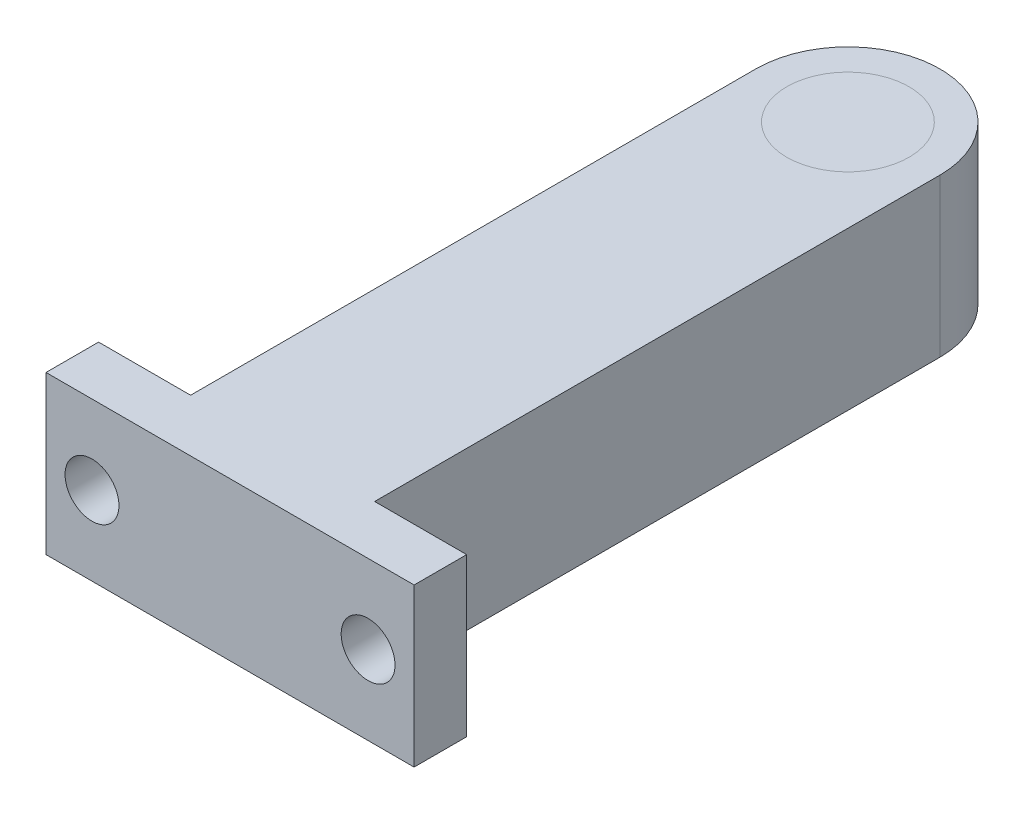
ISO-10303-21;
HEADER;
FILE_DESCRIPTION(('STEP AP214'),'2;1');
FILE_NAME('part.step','',(''),(''),'','','');
FILE_SCHEMA(('AUTOMOTIVE_DESIGN { 1 0 10303 214 1 1 1 1 }'));
ENDSEC;
DATA;
#1=APPLICATION_CONTEXT('core data for automotive mechanical design processes');
#2=APPLICATION_PROTOCOL_DEFINITION('international standard','automotive_design',2000,#1);
#3=PRODUCT_CONTEXT('',#1,'mechanical');
#4=PRODUCT('Part','Part','',(#3));
#5=PRODUCT_RELATED_PRODUCT_CATEGORY('part','',(#4));
#6=PRODUCT_DEFINITION_FORMATION('','',#4);
#7=PRODUCT_DEFINITION_CONTEXT('part definition',#1,'design');
#8=PRODUCT_DEFINITION('design','',#6,#7);
#9=PRODUCT_DEFINITION_SHAPE('','',#8);
#10=(LENGTH_UNIT() NAMED_UNIT(*) SI_UNIT(.MILLI.,.METRE.));
#11=(NAMED_UNIT(*) PLANE_ANGLE_UNIT() SI_UNIT($,.RADIAN.));
#12=(NAMED_UNIT(*) SI_UNIT($,.STERADIAN.) SOLID_ANGLE_UNIT());
#13=UNCERTAINTY_MEASURE_WITH_UNIT(LENGTH_MEASURE(1.E-05),#10,'distance_accuracy_value','');
#14=(GEOMETRIC_REPRESENTATION_CONTEXT(3) GLOBAL_UNCERTAINTY_ASSIGNED_CONTEXT((#13)) GLOBAL_UNIT_ASSIGNED_CONTEXT((#10,
#11,#12)) REPRESENTATION_CONTEXT('',''));
#15=CARTESIAN_POINT('',(0.,0.,0.));
#16=DIRECTION('',(0.,0.,1.));
#17=DIRECTION('',(1.,0.,0.));
#18=AXIS2_PLACEMENT_3D('',#15,#16,#17);
#19=CARTESIAN_POINT('',(0.,5.5,0.));
#20=DIRECTION('',(0.,1.,0.));
#21=DIRECTION('',(0.,0.,1.));
#22=AXIS2_PLACEMENT_3D('',#19,#20,#21);
#23=CYLINDRICAL_SURFACE('',#22,2.325);
#24=CARTESIAN_POINT('',(0.,5.5,0.));
#25=DIRECTION('',(0.,1.,0.));
#26=DIRECTION('',(0.,0.,1.));
#27=AXIS2_PLACEMENT_3D('',#24,#25,#26);
#28=CIRCLE('',#27,2.325);
#29=CARTESIAN_POINT('',(0.,5.5,2.325));
#30=VERTEX_POINT('',#29);
#31=EDGE_CURVE('E11',#30,#30,#28,.T.);
#32=ORIENTED_EDGE('',*,*,#31,.T.);
#33=EDGE_LOOP('',(#32));
#34=FACE_BOUND('',#33,.T.);
#35=CARTESIAN_POINT('',(0.,6.,0.));
#36=DIRECTION('',(0.,1.,0.));
#37=DIRECTION('',(0.,0.,1.));
#38=AXIS2_PLACEMENT_3D('',#35,#36,#37);
#39=CIRCLE('',#38,2.325);
#40=CARTESIAN_POINT('',(0.,6.,2.325));
#41=VERTEX_POINT('',#40);
#42=EDGE_CURVE('E58',#41,#41,#39,.T.);
#43=ORIENTED_EDGE('',*,*,#42,.F.);
#44=EDGE_LOOP('',(#43));
#45=FACE_BOUND('',#44,.T.);
#46=ADVANCED_FACE('F55',(#34,#45),#23,.T.);
#47=CARTESIAN_POINT('',(0.,5.5,0.));
#48=DIRECTION('',(0.,1.,0.));
#49=DIRECTION('',(0.,0.,1.));
#50=AXIS2_PLACEMENT_3D('',#47,#48,#49);
#51=PLANE('',#50);
#52=ORIENTED_EDGE('',*,*,#31,.F.);
#53=EDGE_LOOP('',(#52));
#54=FACE_BOUND('',#53,.T.);
#55=ADVANCED_FACE('F70',(#54),#51,.F.);
#56=CARTESIAN_POINT('',(0.,6.,0.));
#57=DIRECTION('',(0.,1.,0.));
#58=DIRECTION('',(0.,0.,1.));
#59=AXIS2_PLACEMENT_3D('',#56,#57,#58);
#60=PLANE('',#59);
#61=ORIENTED_EDGE('',*,*,#42,.T.);
#62=EDGE_LOOP('',(#61));
#63=FACE_BOUND('',#62,.T.);
#64=ADVANCED_FACE('F67',(#63),#60,.T.);
#65=CLOSED_SHELL('',(#46,#55,#64));
#66=MANIFOLD_SOLID_BREP('B2',#65);
#67=CARTESIAN_POINT('',(3.5,6.,0.));
#68=DIRECTION('',(1.,0.,0.));
#69=DIRECTION('',(0.,0.,-1.));
#70=AXIS2_PLACEMENT_3D('',#67,#68,#69);
#71=PLANE('',#70);
#72=DIRECTION('',(0.,0.,1.));
#73=VECTOR('',#72,1.);
#74=CARTESIAN_POINT('',(3.5,0.,0.));
#75=LINE('',#74,#73);
#76=CARTESIAN_POINT('',(3.5,0.,0.));
#77=VERTEX_POINT('',#76);
#78=CARTESIAN_POINT('',(3.5,0.,21.5));
#79=VERTEX_POINT('',#78);
#80=EDGE_CURVE('E198',#77,#79,#75,.T.);
#81=ORIENTED_EDGE('',*,*,#80,.F.);
#82=DIRECTION('',(0.,-1.,0.));
#83=VECTOR('',#82,1.);
#84=CARTESIAN_POINT('',(3.5,6.,0.));
#85=LINE('',#84,#83);
#86=CARTESIAN_POINT('',(3.5,6.,0.));
#87=VERTEX_POINT('',#86);
#88=EDGE_CURVE('E53',#87,#77,#85,.T.);
#89=ORIENTED_EDGE('',*,*,#88,.F.);
#90=DIRECTION('',(0.,0.,1.));
#91=VECTOR('',#90,1.);
#92=CARTESIAN_POINT('',(3.5,6.,0.));
#93=LINE('',#92,#91);
#94=CARTESIAN_POINT('',(3.5,6.,21.5));
#95=VERTEX_POINT('',#94);
#96=EDGE_CURVE('E114',#87,#95,#93,.T.);
#97=ORIENTED_EDGE('',*,*,#96,.T.);
#98=DIRECTION('',(0.,-1.,0.));
#99=VECTOR('',#98,1.);
#100=CARTESIAN_POINT('',(3.5,6.,21.5));
#101=LINE('',#100,#99);
#102=EDGE_CURVE('E133',#95,#79,#101,.T.);
#103=ORIENTED_EDGE('',*,*,#102,.T.);
#104=EDGE_LOOP('',(#81,#89,#97,#103));
#105=FACE_BOUND('',#104,.T.);
#106=ADVANCED_FACE('F96',(#105),#71,.T.);
#107=CARTESIAN_POINT('',(0.,6.,0.));
#108=DIRECTION('',(0.,-1.,0.));
#109=DIRECTION('',(0.,0.,-1.));
#110=AXIS2_PLACEMENT_3D('',#107,#108,#109);
#111=CYLINDRICAL_SURFACE('',#110,3.5);
#112=CARTESIAN_POINT('',(0.,0.,0.));
#113=DIRECTION('',(0.,1.,0.));
#114=DIRECTION('',(0.,0.,1.));
#115=AXIS2_PLACEMENT_3D('',#112,#113,#114);
#116=CIRCLE('',#115,3.5);
#117=CARTESIAN_POINT('',(-3.5,0.,0.));
#118=VERTEX_POINT('',#117);
#119=EDGE_CURVE('E219',#77,#118,#116,.T.);
#120=ORIENTED_EDGE('',*,*,#119,.T.);
#121=DIRECTION('',(0.,-1.,0.));
#122=VECTOR('',#121,1.);
#123=CARTESIAN_POINT('',(-3.5,6.,0.));
#124=LINE('',#123,#122);
#125=CARTESIAN_POINT('',(-3.5,6.,0.));
#126=VERTEX_POINT('',#125);
#127=EDGE_CURVE('E106',#126,#118,#124,.T.);
#128=ORIENTED_EDGE('',*,*,#127,.F.);
#129=CARTESIAN_POINT('',(0.,6.,0.));
#130=DIRECTION('',(0.,1.,0.));
#131=DIRECTION('',(0.,0.,1.));
#132=AXIS2_PLACEMENT_3D('',#129,#130,#131);
#133=CIRCLE('',#132,3.5);
#134=EDGE_CURVE('E210',#87,#126,#133,.T.);
#135=ORIENTED_EDGE('',*,*,#134,.F.);
#136=ORIENTED_EDGE('',*,*,#88,.T.);
#137=EDGE_LOOP('',(#120,#128,#135,#136));
#138=FACE_BOUND('',#137,.T.);
#139=ADVANCED_FACE('F236',(#138),#111,.T.);
#140=CARTESIAN_POINT('',(-3.5,6.,0.));
#141=DIRECTION('',(1.,0.,0.));
#142=DIRECTION('',(0.,0.,-1.));
#143=AXIS2_PLACEMENT_3D('',#140,#141,#142);
#144=PLANE('',#143);
#145=DIRECTION('',(0.,0.,1.));
#146=VECTOR('',#145,1.);
#147=CARTESIAN_POINT('',(-3.5,0.,0.));
#148=LINE('',#147,#146);
#149=CARTESIAN_POINT('',(-3.5,0.,21.5));
#150=VERTEX_POINT('',#149);
#151=EDGE_CURVE('E129',#118,#150,#148,.T.);
#152=ORIENTED_EDGE('',*,*,#151,.T.);
#153=DIRECTION('',(0.,-1.,0.));
#154=VECTOR('',#153,1.);
#155=CARTESIAN_POINT('',(-3.5,6.,21.5));
#156=LINE('',#155,#154);
#157=CARTESIAN_POINT('',(-3.5,6.,21.5));
#158=VERTEX_POINT('',#157);
#159=EDGE_CURVE('E227',#158,#150,#156,.T.);
#160=ORIENTED_EDGE('',*,*,#159,.F.);
#161=DIRECTION('',(0.,0.,1.));
#162=VECTOR('',#161,1.);
#163=CARTESIAN_POINT('',(-3.5,6.,0.));
#164=LINE('',#163,#162);
#165=EDGE_CURVE('E214',#126,#158,#164,.T.);
#166=ORIENTED_EDGE('',*,*,#165,.F.);
#167=ORIENTED_EDGE('',*,*,#127,.T.);
#168=EDGE_LOOP('',(#152,#160,#166,#167));
#169=FACE_BOUND('',#168,.T.);
#170=ADVANCED_FACE('F233',(#169),#144,.F.);
#171=CARTESIAN_POINT('',(0.,6.,0.));
#172=DIRECTION('',(0.,-1.,0.));
#173=DIRECTION('',(0.,0.,-1.));
#174=AXIS2_PLACEMENT_3D('',#171,#172,#173);
#175=CYLINDRICAL_SURFACE('',#174,2.325);
#176=CARTESIAN_POINT('',(0.,6.,0.));
#177=DIRECTION('',(0.,1.,0.));
#178=DIRECTION('',(0.,0.,1.));
#179=AXIS2_PLACEMENT_3D('',#176,#177,#178);
#180=CIRCLE('',#179,2.325);
#181=CARTESIAN_POINT('',(0.,6.,2.325));
#182=VERTEX_POINT('',#181);
#183=EDGE_CURVE('E204',#182,#182,#180,.T.);
#184=ORIENTED_EDGE('',*,*,#183,.T.);
#185=EDGE_LOOP('',(#184));
#186=FACE_BOUND('',#185,.T.);
#187=CARTESIAN_POINT('',(0.,0.,0.));
#188=DIRECTION('',(0.,1.,0.));
#189=DIRECTION('',(0.,0.,1.));
#190=AXIS2_PLACEMENT_3D('',#187,#188,#189);
#191=CIRCLE('',#190,2.325);
#192=CARTESIAN_POINT('',(0.,0.,2.325));
#193=VERTEX_POINT('',#192);
#194=EDGE_CURVE('E193',#193,#193,#191,.T.);
#195=ORIENTED_EDGE('',*,*,#194,.F.);
#196=EDGE_LOOP('',(#195));
#197=FACE_BOUND('',#196,.T.);
#198=ADVANCED_FACE('F98',(#186,#197),#175,.F.);
#199=CARTESIAN_POINT('',(0.,6.,0.));
#200=DIRECTION('',(0.,1.,0.));
#201=DIRECTION('',(0.,0.,1.));
#202=AXIS2_PLACEMENT_3D('',#199,#200,#201);
#203=PLANE('',#202);
#204=ORIENTED_EDGE('',*,*,#183,.F.);
#205=EDGE_LOOP('',(#204));
#206=FACE_BOUND('',#205,.T.);
#207=ORIENTED_EDGE('',*,*,#96,.F.);
#208=ORIENTED_EDGE('',*,*,#134,.T.);
#209=ORIENTED_EDGE('',*,*,#165,.T.);
#210=DIRECTION('',(-1.,0.,0.));
#211=VECTOR('',#210,1.);
#212=CARTESIAN_POINT('',(-7.,6.,21.5));
#213=LINE('',#212,#211);
#214=CARTESIAN_POINT('',(-7.,6.,21.5));
#215=VERTEX_POINT('',#214);
#216=EDGE_CURVE('E311',#158,#215,#213,.T.);
#217=ORIENTED_EDGE('',*,*,#216,.T.);
#218=DIRECTION('',(0.,0.,-1.));
#219=VECTOR('',#218,1.);
#220=CARTESIAN_POINT('',(-7.,6.,23.5));
#221=LINE('',#220,#219);
#222=CARTESIAN_POINT('',(-7.,6.,23.5));
#223=VERTEX_POINT('',#222);
#224=EDGE_CURVE('E301',#223,#215,#221,.T.);
#225=ORIENTED_EDGE('',*,*,#224,.F.);
#226=DIRECTION('',(-1.,0.,0.));
#227=VECTOR('',#226,1.);
#228=CARTESIAN_POINT('',(-7.,6.,23.5));
#229=LINE('',#228,#227);
#230=CARTESIAN_POINT('',(7.,6.,23.5));
#231=VERTEX_POINT('',#230);
#232=EDGE_CURVE('E182',#231,#223,#229,.T.);
#233=ORIENTED_EDGE('',*,*,#232,.F.);
#234=DIRECTION('',(0.,0.,-1.));
#235=VECTOR('',#234,1.);
#236=CARTESIAN_POINT('',(7.,6.,23.5));
#237=LINE('',#236,#235);
#238=CARTESIAN_POINT('',(7.,6.,21.5));
#239=VERTEX_POINT('',#238);
#240=EDGE_CURVE('E200',#231,#239,#237,.T.);
#241=ORIENTED_EDGE('',*,*,#240,.T.);
#242=EDGE_CURVE('E187',#239,#95,#213,.T.);
#243=ORIENTED_EDGE('',*,*,#242,.T.);
#244=EDGE_LOOP('',(#207,#208,#209,#217,#225,#233,#241,#243));
#245=FACE_BOUND('',#244,.T.);
#246=ADVANCED_FACE('F250',(#206,#245),#203,.T.);
#247=CARTESIAN_POINT('',(0.,0.,0.));
#248=DIRECTION('',(0.,1.,0.));
#249=DIRECTION('',(0.,0.,1.));
#250=AXIS2_PLACEMENT_3D('',#247,#248,#249);
#251=PLANE('',#250);
#252=ORIENTED_EDGE('',*,*,#194,.T.);
#253=EDGE_LOOP('',(#252));
#254=FACE_BOUND('',#253,.T.);
#255=ORIENTED_EDGE('',*,*,#80,.T.);
#256=DIRECTION('',(1.,0.,0.));
#257=VECTOR('',#256,1.);
#258=CARTESIAN_POINT('',(-7.,0.,21.5));
#259=LINE('',#258,#257);
#260=CARTESIAN_POINT('',(7.,0.,21.5));
#261=VERTEX_POINT('',#260);
#262=EDGE_CURVE('E304',#79,#261,#259,.T.);
#263=ORIENTED_EDGE('',*,*,#262,.T.);
#264=DIRECTION('',(0.,0.,-1.));
#265=VECTOR('',#264,1.);
#266=CARTESIAN_POINT('',(7.,0.,23.5));
#267=LINE('',#266,#265);
#268=CARTESIAN_POINT('',(7.,0.,23.5));
#269=VERTEX_POINT('',#268);
#270=EDGE_CURVE('E172',#269,#261,#267,.T.);
#271=ORIENTED_EDGE('',*,*,#270,.F.);
#272=DIRECTION('',(1.,0.,0.));
#273=VECTOR('',#272,1.);
#274=CARTESIAN_POINT('',(-7.,0.,23.5));
#275=LINE('',#274,#273);
#276=CARTESIAN_POINT('',(-7.,0.,23.5));
#277=VERTEX_POINT('',#276);
#278=EDGE_CURVE('E165',#277,#269,#275,.T.);
#279=ORIENTED_EDGE('',*,*,#278,.F.);
#280=DIRECTION('',(0.,0.,-1.));
#281=VECTOR('',#280,1.);
#282=CARTESIAN_POINT('',(-7.,0.,23.5));
#283=LINE('',#282,#281);
#284=CARTESIAN_POINT('',(-7.,0.,21.5));
#285=VERTEX_POINT('',#284);
#286=EDGE_CURVE('E169',#277,#285,#283,.T.);
#287=ORIENTED_EDGE('',*,*,#286,.T.);
#288=EDGE_CURVE('E305',#285,#150,#259,.T.);
#289=ORIENTED_EDGE('',*,*,#288,.T.);
#290=ORIENTED_EDGE('',*,*,#151,.F.);
#291=ORIENTED_EDGE('',*,*,#119,.F.);
#292=EDGE_LOOP('',(#255,#263,#271,#279,#287,#289,#290,#291));
#293=FACE_BOUND('',#292,.T.);
#294=ADVANCED_FACE('F167',(#254,#293),#251,.F.);
#295=CARTESIAN_POINT('',(0.,0.,21.5));
#296=DIRECTION('',(0.,0.,1.));
#297=DIRECTION('',(1.,0.,0.));
#298=AXIS2_PLACEMENT_3D('',#295,#296,#297);
#299=PLANE('',#298);
#300=CARTESIAN_POINT('',(-5.25,3.,21.5));
#301=DIRECTION('',(0.,0.,-1.));
#302=DIRECTION('',(-1.,0.,0.));
#303=AXIS2_PLACEMENT_3D('',#300,#301,#302);
#304=CIRCLE('',#303,1.025);
#305=CARTESIAN_POINT('',(-6.275,3.,21.5));
#306=VERTEX_POINT('',#305);
#307=EDGE_CURVE('E287',#306,#306,#304,.T.);
#308=ORIENTED_EDGE('',*,*,#307,.F.);
#309=EDGE_LOOP('',(#308));
#310=FACE_BOUND('',#309,.T.);
#311=ORIENTED_EDGE('',*,*,#216,.F.);
#312=ORIENTED_EDGE('',*,*,#159,.T.);
#313=ORIENTED_EDGE('',*,*,#288,.F.);
#314=DIRECTION('',(0.,-1.,0.));
#315=VECTOR('',#314,1.);
#316=CARTESIAN_POINT('',(-7.,6.,21.5));
#317=LINE('',#316,#315);
#318=EDGE_CURVE('E191',#215,#285,#317,.T.);
#319=ORIENTED_EDGE('',*,*,#318,.F.);
#320=EDGE_LOOP('',(#311,#312,#313,#319));
#321=FACE_BOUND('',#320,.T.);
#322=ADVANCED_FACE('F249',(#310,#321),#299,.F.);
#323=CARTESIAN_POINT('',(-7.,6.,23.5));
#324=DIRECTION('',(1.,0.,0.));
#325=DIRECTION('',(0.,0.,-1.));
#326=AXIS2_PLACEMENT_3D('',#323,#324,#325);
#327=PLANE('',#326);
#328=ORIENTED_EDGE('',*,*,#318,.T.);
#329=ORIENTED_EDGE('',*,*,#286,.F.);
#330=DIRECTION('',(0.,-1.,0.));
#331=VECTOR('',#330,1.);
#332=CARTESIAN_POINT('',(-7.,6.,23.5));
#333=LINE('',#332,#331);
#334=EDGE_CURVE('E177',#223,#277,#333,.T.);
#335=ORIENTED_EDGE('',*,*,#334,.F.);
#336=ORIENTED_EDGE('',*,*,#224,.T.);
#337=EDGE_LOOP('',(#328,#329,#335,#336));
#338=FACE_BOUND('',#337,.T.);
#339=ADVANCED_FACE('F189',(#338),#327,.F.);
#340=CARTESIAN_POINT('',(7.,6.,23.5));
#341=DIRECTION('',(-1.,0.,0.));
#342=DIRECTION('',(0.,0.,1.));
#343=AXIS2_PLACEMENT_3D('',#340,#341,#342);
#344=PLANE('',#343);
#345=DIRECTION('',(0.,1.,0.));
#346=VECTOR('',#345,1.);
#347=CARTESIAN_POINT('',(7.,6.,21.5));
#348=LINE('',#347,#346);
#349=EDGE_CURVE('E308',#261,#239,#348,.T.);
#350=ORIENTED_EDGE('',*,*,#349,.T.);
#351=ORIENTED_EDGE('',*,*,#240,.F.);
#352=DIRECTION('',(0.,1.,0.));
#353=VECTOR('',#352,1.);
#354=CARTESIAN_POINT('',(7.,6.,23.5));
#355=LINE('',#354,#353);
#356=EDGE_CURVE('E176',#269,#231,#355,.T.);
#357=ORIENTED_EDGE('',*,*,#356,.F.);
#358=ORIENTED_EDGE('',*,*,#270,.T.);
#359=EDGE_LOOP('',(#350,#351,#357,#358));
#360=FACE_BOUND('',#359,.T.);
#361=ADVANCED_FACE('F257',(#360),#344,.F.);
#362=CARTESIAN_POINT('',(0.,0.,23.5));
#363=DIRECTION('',(0.,0.,1.));
#364=DIRECTION('',(1.,0.,0.));
#365=AXIS2_PLACEMENT_3D('',#362,#363,#364);
#366=PLANE('',#365);
#367=CARTESIAN_POINT('',(5.25,3.,23.5));
#368=DIRECTION('',(0.,0.,-1.));
#369=DIRECTION('',(-1.,0.,0.));
#370=AXIS2_PLACEMENT_3D('',#367,#368,#369);
#371=CIRCLE('',#370,1.025);
#372=CARTESIAN_POINT('',(4.225,3.,23.5));
#373=VERTEX_POINT('',#372);
#374=EDGE_CURVE('E280',#373,#373,#371,.T.);
#375=ORIENTED_EDGE('',*,*,#374,.T.);
#376=EDGE_LOOP('',(#375));
#377=FACE_BOUND('',#376,.T.);
#378=CARTESIAN_POINT('',(-5.25,3.,23.5));
#379=DIRECTION('',(0.,0.,-1.));
#380=DIRECTION('',(-1.,0.,0.));
#381=AXIS2_PLACEMENT_3D('',#378,#379,#380);
#382=CIRCLE('',#381,1.025);
#383=CARTESIAN_POINT('',(-6.275,3.,23.5));
#384=VERTEX_POINT('',#383);
#385=EDGE_CURVE('E293',#384,#384,#382,.T.);
#386=ORIENTED_EDGE('',*,*,#385,.T.);
#387=EDGE_LOOP('',(#386));
#388=FACE_BOUND('',#387,.T.);
#389=ORIENTED_EDGE('',*,*,#334,.T.);
#390=ORIENTED_EDGE('',*,*,#278,.T.);
#391=ORIENTED_EDGE('',*,*,#356,.T.);
#392=ORIENTED_EDGE('',*,*,#232,.T.);
#393=EDGE_LOOP('',(#389,#390,#391,#392));
#394=FACE_BOUND('',#393,.T.);
#395=ADVANCED_FACE('F180',(#377,#388,#394),#366,.T.);
#396=CARTESIAN_POINT('',(5.25,3.,21.5));
#397=DIRECTION('',(0.,0.,-1.));
#398=DIRECTION('',(-1.,0.,0.));
#399=AXIS2_PLACEMENT_3D('',#396,#397,#398);
#400=CIRCLE('',#399,1.025);
#401=CARTESIAN_POINT('',(4.225,3.,21.5));
#402=VERTEX_POINT('',#401);
#403=EDGE_CURVE('E283',#402,#402,#400,.T.);
#404=ORIENTED_EDGE('',*,*,#403,.F.);
#405=EDGE_LOOP('',(#404));
#406=FACE_BOUND('',#405,.T.);
#407=ORIENTED_EDGE('',*,*,#102,.F.);
#408=ORIENTED_EDGE('',*,*,#242,.F.);
#409=ORIENTED_EDGE('',*,*,#349,.F.);
#410=ORIENTED_EDGE('',*,*,#262,.F.);
#411=EDGE_LOOP('',(#407,#408,#409,#410));
#412=FACE_BOUND('',#411,.T.);
#413=ADVANCED_FACE('F261',(#406,#412),#299,.F.);
#414=CARTESIAN_POINT('',(-5.25,3.,21.5));
#415=DIRECTION('',(0.,0.,-1.));
#416=DIRECTION('',(-1.,0.,0.));
#417=AXIS2_PLACEMENT_3D('',#414,#415,#416);
#418=CYLINDRICAL_SURFACE('',#417,1.025);
#419=ORIENTED_EDGE('',*,*,#385,.F.);
#420=EDGE_LOOP('',(#419));
#421=FACE_BOUND('',#420,.T.);
#422=ORIENTED_EDGE('',*,*,#307,.T.);
#423=EDGE_LOOP('',(#422));
#424=FACE_BOUND('',#423,.T.);
#425=ADVANCED_FACE('F264',(#421,#424),#418,.F.);
#426=CARTESIAN_POINT('',(5.25,3.,21.5));
#427=DIRECTION('',(0.,0.,-1.));
#428=DIRECTION('',(-1.,0.,0.));
#429=AXIS2_PLACEMENT_3D('',#426,#427,#428);
#430=CYLINDRICAL_SURFACE('',#429,1.025);
#431=ORIENTED_EDGE('',*,*,#374,.F.);
#432=EDGE_LOOP('',(#431));
#433=FACE_BOUND('',#432,.T.);
#434=ORIENTED_EDGE('',*,*,#403,.T.);
#435=EDGE_LOOP('',(#434));
#436=FACE_BOUND('',#435,.T.);
#437=ADVANCED_FACE('F271',(#433,#436),#430,.F.);
#438=CLOSED_SHELL('',(#106,#139,#170,#198,#246,#294,#322,#339,#361,#395,#413,#425,#437));
#439=MANIFOLD_SOLID_BREP('B6',#438);
#440=ADVANCED_BREP_SHAPE_REPRESENTATION('',(#18,#66,#439),#14);
#441=SHAPE_DEFINITION_REPRESENTATION(#9,#440);
ENDSEC;
END-ISO-10303-21;
